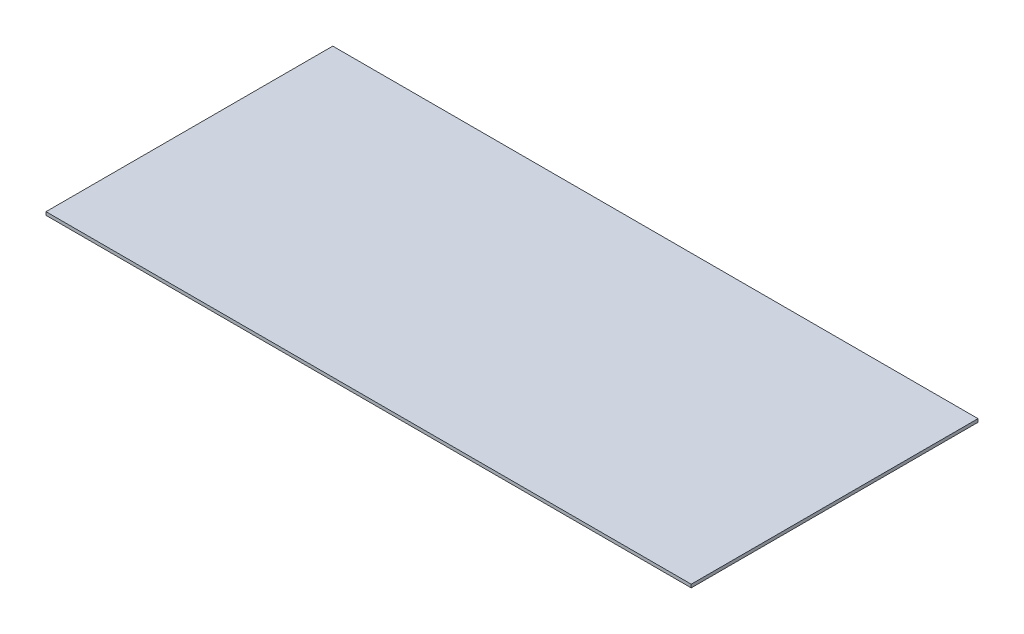
ISO-10303-21;
HEADER;
FILE_DESCRIPTION(('STEP AP214'),'2;1');
FILE_NAME('part.step','',(''),(''),'','','');
FILE_SCHEMA(('AUTOMOTIVE_DESIGN { 1 0 10303 214 1 1 1 1 }'));
ENDSEC;
DATA;
#1=APPLICATION_CONTEXT('core data for automotive mechanical design processes');
#2=APPLICATION_PROTOCOL_DEFINITION('international standard','automotive_design',2000,#1);
#3=PRODUCT_CONTEXT('',#1,'mechanical');
#4=PRODUCT('Part','Part','',(#3));
#5=PRODUCT_RELATED_PRODUCT_CATEGORY('part','',(#4));
#6=PRODUCT_DEFINITION_FORMATION('','',#4);
#7=PRODUCT_DEFINITION_CONTEXT('part definition',#1,'design');
#8=PRODUCT_DEFINITION('design','',#6,#7);
#9=PRODUCT_DEFINITION_SHAPE('','',#8);
#10=(LENGTH_UNIT() NAMED_UNIT(*) SI_UNIT(.MILLI.,.METRE.));
#11=(NAMED_UNIT(*) PLANE_ANGLE_UNIT() SI_UNIT($,.RADIAN.));
#12=(NAMED_UNIT(*) SI_UNIT($,.STERADIAN.) SOLID_ANGLE_UNIT());
#13=UNCERTAINTY_MEASURE_WITH_UNIT(LENGTH_MEASURE(1.E-05),#10,'distance_accuracy_value','');
#14=(GEOMETRIC_REPRESENTATION_CONTEXT(3) GLOBAL_UNCERTAINTY_ASSIGNED_CONTEXT((#13)) GLOBAL_UNIT_ASSIGNED_CONTEXT((#10,
#11,#12)) REPRESENTATION_CONTEXT('',''));
#15=CARTESIAN_POINT('',(0.,0.,0.));
#16=DIRECTION('',(0.,0.,1.));
#17=DIRECTION('',(1.,0.,0.));
#18=AXIS2_PLACEMENT_3D('',#15,#16,#17);
#19=CARTESIAN_POINT('',(0.,0.9,0.));
#20=DIRECTION('',(0.,0.,-1.));
#21=DIRECTION('',(-1.,0.,0.));
#22=AXIS2_PLACEMENT_3D('',#19,#20,#21);
#23=PLANE('',#22);
#24=DIRECTION('',(1.,0.,0.));
#25=VECTOR('',#24,1.);
#26=CARTESIAN_POINT('',(0.,0.,0.));
#27=LINE('',#26,#25);
#28=CARTESIAN_POINT('',(0.,0.,0.));
#29=VERTEX_POINT('',#28);
#30=CARTESIAN_POINT('',(180.,0.,0.));
#31=VERTEX_POINT('',#30);
#32=EDGE_CURVE('E101',#29,#31,#27,.T.);
#33=ORIENTED_EDGE('',*,*,#32,.T.);
#34=DIRECTION('',(0.,-1.,0.));
#35=VECTOR('',#34,1.);
#36=CARTESIAN_POINT('',(180.,0.9,0.));
#37=LINE('',#36,#35);
#38=CARTESIAN_POINT('',(180.,0.9,0.));
#39=VERTEX_POINT('',#38);
#40=EDGE_CURVE('E11',#39,#31,#37,.T.);
#41=ORIENTED_EDGE('',*,*,#40,.F.);
#42=DIRECTION('',(1.,0.,0.));
#43=VECTOR('',#42,1.);
#44=CARTESIAN_POINT('',(0.,0.9,0.));
#45=LINE('',#44,#43);
#46=CARTESIAN_POINT('',(0.,0.9,0.));
#47=VERTEX_POINT('',#46);
#48=EDGE_CURVE('E87',#47,#39,#45,.T.);
#49=ORIENTED_EDGE('',*,*,#48,.F.);
#50=DIRECTION('',(0.,-1.,0.));
#51=VECTOR('',#50,1.);
#52=CARTESIAN_POINT('',(0.,0.9,0.));
#53=LINE('',#52,#51);
#54=EDGE_CURVE('E54',#47,#29,#53,.T.);
#55=ORIENTED_EDGE('',*,*,#54,.T.);
#56=EDGE_LOOP('',(#33,#41,#49,#55));
#57=FACE_BOUND('',#56,.T.);
#58=ADVANCED_FACE('F38',(#57),#23,.F.);
#59=CARTESIAN_POINT('',(180.,0.9,0.));
#60=DIRECTION('',(-1.,0.,0.));
#61=DIRECTION('',(0.,0.,1.));
#62=AXIS2_PLACEMENT_3D('',#59,#60,#61);
#63=PLANE('',#62);
#64=DIRECTION('',(0.,0.,-1.));
#65=VECTOR('',#64,1.);
#66=CARTESIAN_POINT('',(180.,0.,0.));
#67=LINE('',#66,#65);
#68=CARTESIAN_POINT('',(180.,0.,-80.));
#69=VERTEX_POINT('',#68);
#70=EDGE_CURVE('E92',#31,#69,#67,.T.);
#71=ORIENTED_EDGE('',*,*,#70,.T.);
#72=DIRECTION('',(0.,-1.,0.));
#73=VECTOR('',#72,1.);
#74=CARTESIAN_POINT('',(180.,0.9,-80.));
#75=LINE('',#74,#73);
#76=CARTESIAN_POINT('',(180.,0.9,-80.));
#77=VERTEX_POINT('',#76);
#78=EDGE_CURVE('E46',#77,#69,#75,.T.);
#79=ORIENTED_EDGE('',*,*,#78,.F.);
#80=DIRECTION('',(0.,0.,-1.));
#81=VECTOR('',#80,1.);
#82=CARTESIAN_POINT('',(180.,0.9,0.));
#83=LINE('',#82,#81);
#84=EDGE_CURVE('E79',#39,#77,#83,.T.);
#85=ORIENTED_EDGE('',*,*,#84,.F.);
#86=ORIENTED_EDGE('',*,*,#40,.T.);
#87=EDGE_LOOP('',(#71,#79,#85,#86));
#88=FACE_BOUND('',#87,.T.);
#89=ADVANCED_FACE('F91',(#88),#63,.F.);
#90=CARTESIAN_POINT('',(0.,0.9,-80.));
#91=DIRECTION('',(0.,0.,-1.));
#92=DIRECTION('',(-1.,0.,0.));
#93=AXIS2_PLACEMENT_3D('',#90,#91,#92);
#94=PLANE('',#93);
#95=DIRECTION('',(1.,0.,0.));
#96=VECTOR('',#95,1.);
#97=CARTESIAN_POINT('',(0.,0.,-80.));
#98=LINE('',#97,#96);
#99=CARTESIAN_POINT('',(0.,0.,-80.));
#100=VERTEX_POINT('',#99);
#101=EDGE_CURVE('E104',#100,#69,#98,.T.);
#102=ORIENTED_EDGE('',*,*,#101,.F.);
#103=DIRECTION('',(0.,-1.,0.));
#104=VECTOR('',#103,1.);
#105=CARTESIAN_POINT('',(0.,0.9,-80.));
#106=LINE('',#105,#104);
#107=CARTESIAN_POINT('',(0.,0.9,-80.));
#108=VERTEX_POINT('',#107);
#109=EDGE_CURVE('E68',#108,#100,#106,.T.);
#110=ORIENTED_EDGE('',*,*,#109,.F.);
#111=DIRECTION('',(1.,0.,0.));
#112=VECTOR('',#111,1.);
#113=CARTESIAN_POINT('',(0.,0.9,-80.));
#114=LINE('',#113,#112);
#115=EDGE_CURVE('E86',#108,#77,#114,.T.);
#116=ORIENTED_EDGE('',*,*,#115,.T.);
#117=ORIENTED_EDGE('',*,*,#78,.T.);
#118=EDGE_LOOP('',(#102,#110,#116,#117));
#119=FACE_BOUND('',#118,.T.);
#120=ADVANCED_FACE('F95',(#119),#94,.T.);
#121=CARTESIAN_POINT('',(0.,0.9,0.));
#122=DIRECTION('',(-1.,0.,0.));
#123=DIRECTION('',(0.,0.,1.));
#124=AXIS2_PLACEMENT_3D('',#121,#122,#123);
#125=PLANE('',#124);
#126=DIRECTION('',(0.,0.,-1.));
#127=VECTOR('',#126,1.);
#128=CARTESIAN_POINT('',(0.,0.,0.));
#129=LINE('',#128,#127);
#130=EDGE_CURVE('E106',#29,#100,#129,.T.);
#131=ORIENTED_EDGE('',*,*,#130,.F.);
#132=ORIENTED_EDGE('',*,*,#54,.F.);
#133=DIRECTION('',(0.,0.,-1.));
#134=VECTOR('',#133,1.);
#135=CARTESIAN_POINT('',(0.,0.9,0.));
#136=LINE('',#135,#134);
#137=EDGE_CURVE('E96',#47,#108,#136,.T.);
#138=ORIENTED_EDGE('',*,*,#137,.T.);
#139=ORIENTED_EDGE('',*,*,#109,.T.);
#140=EDGE_LOOP('',(#131,#132,#138,#139));
#141=FACE_BOUND('',#140,.T.);
#142=ADVANCED_FACE('F112',(#141),#125,.T.);
#143=CARTESIAN_POINT('',(0.,0.9,0.));
#144=DIRECTION('',(0.,1.,0.));
#145=DIRECTION('',(0.,0.,1.));
#146=AXIS2_PLACEMENT_3D('',#143,#144,#145);
#147=PLANE('',#146);
#148=ORIENTED_EDGE('',*,*,#48,.T.);
#149=ORIENTED_EDGE('',*,*,#84,.T.);
#150=ORIENTED_EDGE('',*,*,#115,.F.);
#151=ORIENTED_EDGE('',*,*,#137,.F.);
#152=EDGE_LOOP('',(#148,#149,#150,#151));
#153=FACE_BOUND('',#152,.T.);
#154=ADVANCED_FACE('F83',(#153),#147,.T.);
#155=CARTESIAN_POINT('',(0.,0.,0.));
#156=DIRECTION('',(0.,1.,0.));
#157=DIRECTION('',(0.,0.,1.));
#158=AXIS2_PLACEMENT_3D('',#155,#156,#157);
#159=PLANE('',#158);
#160=ORIENTED_EDGE('',*,*,#32,.F.);
#161=ORIENTED_EDGE('',*,*,#130,.T.);
#162=ORIENTED_EDGE('',*,*,#101,.T.);
#163=ORIENTED_EDGE('',*,*,#70,.F.);
#164=EDGE_LOOP('',(#160,#161,#162,#163));
#165=FACE_BOUND('',#164,.T.);
#166=ADVANCED_FACE('F111',(#165),#159,.F.);
#167=CLOSED_SHELL('',(#58,#89,#120,#142,#154,#166));
#168=MANIFOLD_SOLID_BREP('B2',#167);
#169=ADVANCED_BREP_SHAPE_REPRESENTATION('',(#18,#168),#14);
#170=SHAPE_DEFINITION_REPRESENTATION(#9,#169);
ENDSEC;
END-ISO-10303-21;
